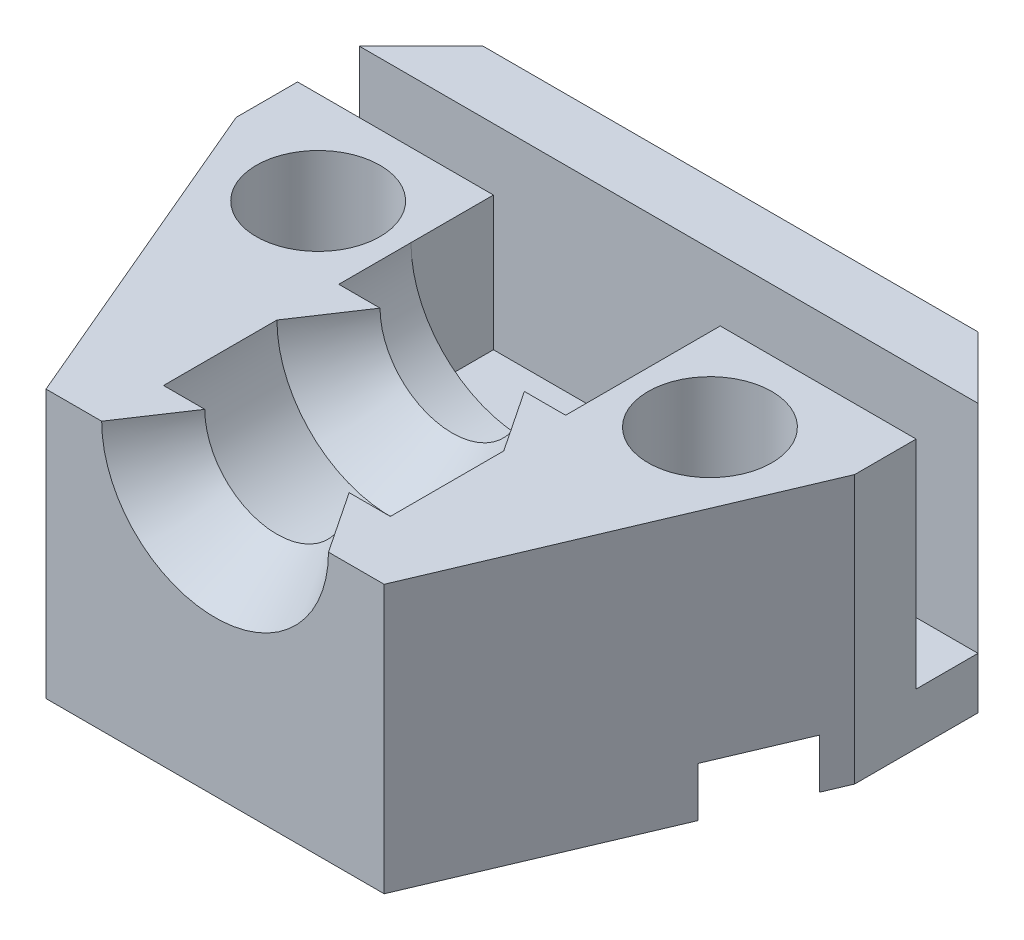
ISO-10303-21;
HEADER;
FILE_DESCRIPTION(('STEP AP214'),'2;1');
FILE_NAME('part.step','',(''),(''),'','','');
FILE_SCHEMA(('AUTOMOTIVE_DESIGN { 1 0 10303 214 1 1 1 1 }'));
ENDSEC;
DATA;
#1=APPLICATION_CONTEXT('core data for automotive mechanical design processes');
#2=APPLICATION_PROTOCOL_DEFINITION('international standard','automotive_design',2000,#1);
#3=PRODUCT_CONTEXT('',#1,'mechanical');
#4=PRODUCT('Part','Part','',(#3));
#5=PRODUCT_RELATED_PRODUCT_CATEGORY('part','',(#4));
#6=PRODUCT_DEFINITION_FORMATION('','',#4);
#7=PRODUCT_DEFINITION_CONTEXT('part definition',#1,'design');
#8=PRODUCT_DEFINITION('design','',#6,#7);
#9=PRODUCT_DEFINITION_SHAPE('','',#8);
#10=(LENGTH_UNIT() NAMED_UNIT(*) SI_UNIT(.MILLI.,.METRE.));
#11=(NAMED_UNIT(*) PLANE_ANGLE_UNIT() SI_UNIT($,.RADIAN.));
#12=(NAMED_UNIT(*) SI_UNIT($,.STERADIAN.) SOLID_ANGLE_UNIT());
#13=UNCERTAINTY_MEASURE_WITH_UNIT(LENGTH_MEASURE(1.E-05),#10,'distance_accuracy_value','');
#14=(GEOMETRIC_REPRESENTATION_CONTEXT(3) GLOBAL_UNCERTAINTY_ASSIGNED_CONTEXT((#13)) GLOBAL_UNIT_ASSIGNED_CONTEXT((#10,
#11,#12)) REPRESENTATION_CONTEXT('',''));
#15=CARTESIAN_POINT('',(0.,0.,0.));
#16=DIRECTION('',(0.,0.,1.));
#17=DIRECTION('',(1.,0.,0.));
#18=AXIS2_PLACEMENT_3D('',#15,#16,#17);
#19=CARTESIAN_POINT('',(0.,6.5,0.));
#20=DIRECTION('',(0.,1.,0.));
#21=DIRECTION('',(0.,0.,1.));
#22=AXIS2_PLACEMENT_3D('',#19,#20,#21);
#23=PLANE('',#22);
#24=CARTESIAN_POINT('',(4.75,6.5,-1.));
#25=DIRECTION('',(0.,1.,0.));
#26=DIRECTION('',(0.,0.,1.));
#27=AXIS2_PLACEMENT_3D('',#24,#25,#26);
#28=CIRCLE('',#27,1.5);
#29=CARTESIAN_POINT('',(4.75,6.5,-2.5));
#30=VERTEX_POINT('',#29);
#31=EDGE_CURVE('E297',#30,#30,#28,.T.);
#32=ORIENTED_EDGE('',*,*,#31,.F.);
#33=EDGE_LOOP('',(#32));
#34=FACE_BOUND('',#33,.T.);
#35=DIRECTION('',(-1.,0.,0.));
#36=VECTOR('',#35,1.);
#37=CARTESIAN_POINT('',(0.,6.5,-3.25));
#38=LINE('',#37,#36);
#39=CARTESIAN_POINT('',(7.5,6.5,-3.25));
#40=VERTEX_POINT('',#39);
#41=CARTESIAN_POINT('',(2.75,6.5,-3.25));
#42=VERTEX_POINT('',#41);
#43=EDGE_CURVE('E267',#40,#42,#38,.T.);
#44=ORIENTED_EDGE('',*,*,#43,.T.);
#45=DIRECTION('',(0.,0.,1.));
#46=VECTOR('',#45,1.);
#47=CARTESIAN_POINT('',(2.75,6.5,0.));
#48=LINE('',#47,#46);
#49=CARTESIAN_POINT('',(2.75,6.5,-1.25));
#50=VERTEX_POINT('',#49);
#51=EDGE_CURVE('E220',#42,#50,#48,.T.);
#52=ORIENTED_EDGE('',*,*,#51,.T.);
#53=DIRECTION('',(0.,0.,1.));
#54=VECTOR('',#53,1.);
#55=CARTESIAN_POINT('',(2.75000000000001,6.5,6.25));
#56=LINE('',#55,#54);
#57=CARTESIAN_POINT('',(2.75,6.5,0.5));
#58=VERTEX_POINT('',#57);
#59=EDGE_CURVE('E377',#58,#50,#56,.F.);
#60=ORIENTED_EDGE('',*,*,#59,.F.);
#61=DIRECTION('',(1.,0.,0.));
#62=VECTOR('',#61,1.);
#63=CARTESIAN_POINT('',(0.,6.5,0.500000000000001));
#64=LINE('',#63,#62);
#65=CARTESIAN_POINT('',(1.75,6.5,0.500000000000001));
#66=VERTEX_POINT('',#65);
#67=EDGE_CURVE('E375',#66,#58,#64,.T.);
#68=ORIENTED_EDGE('',*,*,#67,.F.);
#69=DIRECTION('',(-0.554700196225229,0.,-0.832050294337843));
#70=VECTOR('',#69,1.);
#71=CARTESIAN_POINT('',(0.,6.5,-2.125));
#72=LINE('',#71,#70);
#73=CARTESIAN_POINT('',(2.75,6.5,2.));
#74=VERTEX_POINT('',#73);
#75=EDGE_CURVE('E373',#74,#66,#72,.T.);
#76=ORIENTED_EDGE('',*,*,#75,.F.);
#77=DIRECTION('',(0.,0.,1.));
#78=VECTOR('',#77,1.);
#79=CARTESIAN_POINT('',(2.75,6.5,6.25));
#80=LINE('',#79,#78);
#81=CARTESIAN_POINT('',(2.75,6.5,4.75));
#82=VERTEX_POINT('',#81);
#83=EDGE_CURVE('E370',#82,#74,#80,.F.);
#84=ORIENTED_EDGE('',*,*,#83,.F.);
#85=DIRECTION('',(1.,0.,0.));
#86=VECTOR('',#85,1.);
#87=CARTESIAN_POINT('',(0.,6.5,4.75));
#88=LINE('',#87,#86);
#89=CARTESIAN_POINT('',(1.75,6.5,4.75));
#90=VERTEX_POINT('',#89);
#91=EDGE_CURVE('E368',#90,#82,#88,.T.);
#92=ORIENTED_EDGE('',*,*,#91,.F.);
#93=DIRECTION('',(-0.554700196225229,0.,-0.832050294337844));
#94=VECTOR('',#93,1.);
#95=CARTESIAN_POINT('',(0.,6.5,2.12499999999999));
#96=LINE('',#95,#94);
#97=CARTESIAN_POINT('',(2.75,6.5,6.25));
#98=VERTEX_POINT('',#97);
#99=EDGE_CURVE('E250',#98,#90,#96,.T.);
#100=ORIENTED_EDGE('',*,*,#99,.F.);
#101=DIRECTION('',(1.,0.,0.));
#102=VECTOR('',#101,1.);
#103=CARTESIAN_POINT('',(-7.5,6.5,6.25));
#104=LINE('',#103,#102);
#105=CARTESIAN_POINT('',(4.09999999999999,6.5,6.25));
#106=VERTEX_POINT('',#105);
#107=EDGE_CURVE('E311',#98,#106,#104,.T.);
#108=ORIENTED_EDGE('',*,*,#107,.T.);
#109=DIRECTION('',(-0.390731128489275,0.,0.92050485345244));
#110=VECTOR('',#109,1.);
#111=CARTESIAN_POINT('',(5.72198653549922,6.5,2.42883918300988));
#112=LINE('',#111,#110);
#113=CARTESIAN_POINT('',(7.5,6.5,-1.75989804380075));
#114=VERTEX_POINT('',#113);
#115=EDGE_CURVE('E340',#106,#114,#112,.F.);
#116=ORIENTED_EDGE('',*,*,#115,.T.);
#117=DIRECTION('',(0.,0.,-1.));
#118=VECTOR('',#117,1.);
#119=CARTESIAN_POINT('',(7.5,6.5,-6.25));
#120=LINE('',#119,#118);
#121=EDGE_CURVE('E303',#114,#40,#120,.T.);
#122=ORIENTED_EDGE('',*,*,#121,.T.);
#123=EDGE_LOOP('',(#44,#52,#60,#68,#76,#84,#92,#100,#108,#116,#122));
#124=FACE_BOUND('',#123,.T.);
#125=ADVANCED_FACE('F33',(#34,#124),#23,.T.);
#126=CARTESIAN_POINT('',(-4.75,6.5,-1.));
#127=DIRECTION('',(0.,1.,0.));
#128=DIRECTION('',(0.,0.,1.));
#129=AXIS2_PLACEMENT_3D('',#126,#127,#128);
#130=CIRCLE('',#129,1.5);
#131=CARTESIAN_POINT('',(-4.75,6.5,-2.5));
#132=VERTEX_POINT('',#131);
#133=EDGE_CURVE('E288',#132,#132,#130,.T.);
#134=ORIENTED_EDGE('',*,*,#133,.F.);
#135=EDGE_LOOP('',(#134));
#136=FACE_BOUND('',#135,.T.);
#137=DIRECTION('',(0.,0.,1.));
#138=VECTOR('',#137,1.);
#139=CARTESIAN_POINT('',(-2.75,6.5,6.25));
#140=LINE('',#139,#138);
#141=CARTESIAN_POINT('',(-2.75,6.5,-1.25));
#142=VERTEX_POINT('',#141);
#143=CARTESIAN_POINT('',(-2.75,6.5,0.500000000000003));
#144=VERTEX_POINT('',#143);
#145=EDGE_CURVE('E381',#142,#144,#140,.T.);
#146=ORIENTED_EDGE('',*,*,#145,.F.);
#147=DIRECTION('',(0.,0.,-1.));
#148=VECTOR('',#147,1.);
#149=CARTESIAN_POINT('',(-2.75,6.5,0.));
#150=LINE('',#149,#148);
#151=CARTESIAN_POINT('',(-2.75,6.5,-3.25));
#152=VERTEX_POINT('',#151);
#153=EDGE_CURVE('E429',#142,#152,#150,.T.);
#154=ORIENTED_EDGE('',*,*,#153,.T.);
#155=CARTESIAN_POINT('',(-7.5,6.5,-3.25));
#156=VERTEX_POINT('',#155);
#157=EDGE_CURVE('E225',#152,#156,#38,.T.);
#158=ORIENTED_EDGE('',*,*,#157,.T.);
#159=DIRECTION('',(0.,0.,1.));
#160=VECTOR('',#159,1.);
#161=CARTESIAN_POINT('',(-7.5,6.5,-6.25));
#162=LINE('',#161,#160);
#163=CARTESIAN_POINT('',(-7.5,6.5,-1.75989804380075));
#164=VERTEX_POINT('',#163);
#165=EDGE_CURVE('E309',#156,#164,#162,.T.);
#166=ORIENTED_EDGE('',*,*,#165,.T.);
#167=DIRECTION('',(-0.390731128489275,0.,-0.92050485345244));
#168=VECTOR('',#167,1.);
#169=CARTESIAN_POINT('',(-5.72198653549922,6.5,2.42883918300987));
#170=LINE('',#169,#168);
#171=CARTESIAN_POINT('',(-4.09999999999999,6.5,6.25));
#172=VERTEX_POINT('',#171);
#173=EDGE_CURVE('E342',#164,#172,#170,.F.);
#174=ORIENTED_EDGE('',*,*,#173,.T.);
#175=CARTESIAN_POINT('',(-2.75,6.5,6.25));
#176=VERTEX_POINT('',#175);
#177=EDGE_CURVE('E312',#172,#176,#104,.T.);
#178=ORIENTED_EDGE('',*,*,#177,.T.);
#179=DIRECTION('',(-0.554700196225228,0.,0.832050294337844));
#180=VECTOR('',#179,1.);
#181=CARTESIAN_POINT('',(0.,6.5,2.12499999999999));
#182=LINE('',#181,#180);
#183=CARTESIAN_POINT('',(-1.75,6.5,4.75));
#184=VERTEX_POINT('',#183);
#185=EDGE_CURVE('E252',#184,#176,#182,.T.);
#186=ORIENTED_EDGE('',*,*,#185,.F.);
#187=CARTESIAN_POINT('',(-2.75,6.5,4.75));
#188=VERTEX_POINT('',#187);
#189=EDGE_CURVE('E371',#188,#184,#88,.T.);
#190=ORIENTED_EDGE('',*,*,#189,.F.);
#191=DIRECTION('',(0.,0.,1.));
#192=VECTOR('',#191,1.);
#193=CARTESIAN_POINT('',(-2.75,6.5,6.25));
#194=LINE('',#193,#192);
#195=CARTESIAN_POINT('',(-2.75,6.5,2.));
#196=VERTEX_POINT('',#195);
#197=EDGE_CURVE('E385',#196,#188,#194,.T.);
#198=ORIENTED_EDGE('',*,*,#197,.F.);
#199=DIRECTION('',(-0.554700196225229,0.,0.832050294337844));
#200=VECTOR('',#199,1.);
#201=CARTESIAN_POINT('',(0.,6.5,-2.125));
#202=LINE('',#201,#200);
#203=CARTESIAN_POINT('',(-1.75,6.5,0.500000000000002));
#204=VERTEX_POINT('',#203);
#205=EDGE_CURVE('E383',#204,#196,#202,.T.);
#206=ORIENTED_EDGE('',*,*,#205,.F.);
#207=EDGE_CURVE('E378',#144,#204,#64,.T.);
#208=ORIENTED_EDGE('',*,*,#207,.F.);
#209=EDGE_LOOP('',(#146,#154,#158,#166,#174,#178,#186,#190,#198,#206,#208));
#210=FACE_BOUND('',#209,.T.);
#211=ADVANCED_FACE('F427',(#136,#210),#23,.T.);
#212=CARTESIAN_POINT('',(0.,1.25,-3.25));
#213=DIRECTION('',(0.,0.,-1.));
#214=DIRECTION('',(-1.,0.,0.));
#215=AXIS2_PLACEMENT_3D('',#212,#213,#214);
#216=PLANE('',#215);
#217=DIRECTION('',(1.,0.,0.));
#218=VECTOR('',#217,1.);
#219=CARTESIAN_POINT('',(0.,3.25,-3.25));
#220=LINE('',#219,#218);
#221=CARTESIAN_POINT('',(-2.75,3.25,-3.25));
#222=VERTEX_POINT('',#221);
#223=CARTESIAN_POINT('',(2.75,3.25,-3.25));
#224=VERTEX_POINT('',#223);
#225=EDGE_CURVE('E212',#222,#224,#220,.T.);
#226=ORIENTED_EDGE('',*,*,#225,.T.);
#227=DIRECTION('',(0.,1.,0.));
#228=VECTOR('',#227,1.);
#229=CARTESIAN_POINT('',(2.75,3.25,-3.25));
#230=LINE('',#229,#228);
#231=EDGE_CURVE('E236',#224,#42,#230,.T.);
#232=ORIENTED_EDGE('',*,*,#231,.T.);
#233=ORIENTED_EDGE('',*,*,#43,.F.);
#234=DIRECTION('',(0.,1.,0.));
#235=VECTOR('',#234,1.);
#236=CARTESIAN_POINT('',(7.5,1.25,-3.25));
#237=LINE('',#236,#235);
#238=CARTESIAN_POINT('',(7.5,1.25,-3.25));
#239=VERTEX_POINT('',#238);
#240=EDGE_CURVE('E266',#239,#40,#237,.T.);
#241=ORIENTED_EDGE('',*,*,#240,.F.);
#242=DIRECTION('',(-1.,0.,0.));
#243=VECTOR('',#242,1.);
#244=CARTESIAN_POINT('',(0.,1.25,-3.25));
#245=LINE('',#244,#243);
#246=CARTESIAN_POINT('',(-7.5,1.25,-3.25));
#247=VERTEX_POINT('',#246);
#248=EDGE_CURVE('E254',#239,#247,#245,.T.);
#249=ORIENTED_EDGE('',*,*,#248,.T.);
#250=DIRECTION('',(0.,1.,0.));
#251=VECTOR('',#250,1.);
#252=CARTESIAN_POINT('',(-7.5,1.25,-3.25));
#253=LINE('',#252,#251);
#254=EDGE_CURVE('E271',#247,#156,#253,.T.);
#255=ORIENTED_EDGE('',*,*,#254,.T.);
#256=ORIENTED_EDGE('',*,*,#157,.F.);
#257=DIRECTION('',(0.,1.,0.));
#258=VECTOR('',#257,1.);
#259=CARTESIAN_POINT('',(-2.75,3.25,-3.25));
#260=LINE('',#259,#258);
#261=EDGE_CURVE('E205',#222,#152,#260,.T.);
#262=ORIENTED_EDGE('',*,*,#261,.F.);
#263=EDGE_LOOP('',(#226,#232,#233,#241,#249,#255,#256,#262));
#264=FACE_BOUND('',#263,.T.);
#265=ADVANCED_FACE('F223',(#264),#216,.T.);
#266=CARTESIAN_POINT('',(7.5,6.5,-6.25));
#267=DIRECTION('',(-1.,0.,0.));
#268=DIRECTION('',(0.,0.,1.));
#269=AXIS2_PLACEMENT_3D('',#266,#267,#268);
#270=PLANE('',#269);
#271=DIRECTION('',(0.,0.,-1.));
#272=VECTOR('',#271,1.);
#273=CARTESIAN_POINT('',(7.5,0.,-6.25));
#274=LINE('',#273,#272);
#275=CARTESIAN_POINT('',(7.5,0.,-1.75989804380075));
#276=VERTEX_POINT('',#275);
#277=CARTESIAN_POINT('',(7.5,0.,-4.75));
#278=VERTEX_POINT('',#277);
#279=EDGE_CURVE('E300',#276,#278,#274,.T.);
#280=ORIENTED_EDGE('',*,*,#279,.T.);
#281=DIRECTION('',(0.,1.,0.));
#282=VECTOR('',#281,1.);
#283=CARTESIAN_POINT('',(7.5,6.5,-4.75));
#284=LINE('',#283,#282);
#285=CARTESIAN_POINT('',(7.5,1.25,-4.75));
#286=VERTEX_POINT('',#285);
#287=EDGE_CURVE('E11',#278,#286,#284,.T.);
#288=ORIENTED_EDGE('',*,*,#287,.T.);
#289=DIRECTION('',(0.,0.,-1.));
#290=VECTOR('',#289,1.);
#291=CARTESIAN_POINT('',(7.5,1.25,0.));
#292=LINE('',#291,#290);
#293=EDGE_CURVE('E256',#239,#286,#292,.T.);
#294=ORIENTED_EDGE('',*,*,#293,.F.);
#295=ORIENTED_EDGE('',*,*,#240,.T.);
#296=ORIENTED_EDGE('',*,*,#121,.F.);
#297=DIRECTION('',(0.,-1.,0.));
#298=VECTOR('',#297,1.);
#299=CARTESIAN_POINT('',(7.5,6.5,-1.75989804380075));
#300=LINE('',#299,#298);
#301=EDGE_CURVE('E344',#114,#276,#300,.T.);
#302=ORIENTED_EDGE('',*,*,#301,.T.);
#303=EDGE_LOOP('',(#280,#288,#294,#295,#296,#302));
#304=FACE_BOUND('',#303,.T.);
#305=ADVANCED_FACE('F440',(#304),#270,.F.);
#306=CARTESIAN_POINT('',(-7.5,6.5,-6.25));
#307=DIRECTION('',(1.,0.,0.));
#308=DIRECTION('',(0.,0.,-1.));
#309=AXIS2_PLACEMENT_3D('',#306,#307,#308);
#310=PLANE('',#309);
#311=DIRECTION('',(0.,0.,1.));
#312=VECTOR('',#311,1.);
#313=CARTESIAN_POINT('',(-7.5,1.25,0.));
#314=LINE('',#313,#312);
#315=CARTESIAN_POINT('',(-7.5,1.25,-4.75));
#316=VERTEX_POINT('',#315);
#317=EDGE_CURVE('E263',#316,#247,#314,.T.);
#318=ORIENTED_EDGE('',*,*,#317,.F.);
#319=DIRECTION('',(0.,-1.,0.));
#320=VECTOR('',#319,1.);
#321=CARTESIAN_POINT('',(-7.5,6.5,-4.75));
#322=LINE('',#321,#320);
#323=CARTESIAN_POINT('',(-7.5,0.,-4.75));
#324=VERTEX_POINT('',#323);
#325=EDGE_CURVE('E387',#316,#324,#322,.T.);
#326=ORIENTED_EDGE('',*,*,#325,.T.);
#327=DIRECTION('',(0.,0.,1.));
#328=VECTOR('',#327,1.);
#329=CARTESIAN_POINT('',(-7.5,0.,-6.25));
#330=LINE('',#329,#328);
#331=CARTESIAN_POINT('',(-7.5,0.,-1.75989804380075));
#332=VERTEX_POINT('',#331);
#333=EDGE_CURVE('E320',#324,#332,#330,.T.);
#334=ORIENTED_EDGE('',*,*,#333,.T.);
#335=DIRECTION('',(0.,1.,0.));
#336=VECTOR('',#335,1.);
#337=CARTESIAN_POINT('',(-7.5,6.5,-1.75989804380075));
#338=LINE('',#337,#336);
#339=EDGE_CURVE('E337',#332,#164,#338,.T.);
#340=ORIENTED_EDGE('',*,*,#339,.T.);
#341=ORIENTED_EDGE('',*,*,#165,.F.);
#342=ORIENTED_EDGE('',*,*,#254,.F.);
#343=EDGE_LOOP('',(#318,#326,#334,#340,#341,#342));
#344=FACE_BOUND('',#343,.T.);
#345=ADVANCED_FACE('F411',(#344),#310,.F.);
#346=DIRECTION('',(-1.,0.,0.));
#347=VECTOR('',#346,1.);
#348=CARTESIAN_POINT('',(-7.5,6.5,-6.25));
#349=LINE('',#348,#347);
#350=CARTESIAN_POINT('',(6.,6.5,-6.25));
#351=VERTEX_POINT('',#350);
#352=CARTESIAN_POINT('',(-6.,6.5,-6.25));
#353=VERTEX_POINT('',#352);
#354=EDGE_CURVE('E306',#351,#353,#349,.T.);
#355=ORIENTED_EDGE('',*,*,#354,.T.);
#356=DIRECTION('',(0.707106781186549,0.,-0.707106781186547));
#357=VECTOR('',#356,1.);
#358=CARTESIAN_POINT('',(-6.12499999999999,6.5,-6.12500000000001));
#359=LINE('',#358,#357);
#360=CARTESIAN_POINT('',(-7.5,6.5,-4.75));
#361=VERTEX_POINT('',#360);
#362=EDGE_CURVE('E41',#353,#361,#359,.F.);
#363=ORIENTED_EDGE('',*,*,#362,.T.);
#364=DIRECTION('',(1.,0.,0.));
#365=VECTOR('',#364,1.);
#366=CARTESIAN_POINT('',(0.,6.5,-4.75));
#367=LINE('',#366,#365);
#368=CARTESIAN_POINT('',(7.5,6.5,-4.75));
#369=VERTEX_POINT('',#368);
#370=EDGE_CURVE('E257',#361,#369,#367,.T.);
#371=ORIENTED_EDGE('',*,*,#370,.T.);
#372=DIRECTION('',(0.707106781186546,0.,0.707106781186548));
#373=VECTOR('',#372,1.);
#374=CARTESIAN_POINT('',(6.12500000000001,6.5,-6.12499999999999));
#375=LINE('',#374,#373);
#376=EDGE_CURVE('E55',#369,#351,#375,.F.);
#377=ORIENTED_EDGE('',*,*,#376,.T.);
#378=EDGE_LOOP('',(#355,#363,#371,#377));
#379=FACE_BOUND('',#378,.T.);
#380=ADVANCED_FACE('F399',(#379),#23,.T.);
#381=CARTESIAN_POINT('',(0.,0.,0.));
#382=DIRECTION('',(0.,1.,0.));
#383=DIRECTION('',(0.,0.,1.));
#384=AXIS2_PLACEMENT_3D('',#381,#382,#383);
#385=PLANE('',#384);
#386=ORIENTED_EDGE('',*,*,#333,.F.);
#387=DIRECTION('',(-0.707106781186549,0.,0.707106781186547));
#388=VECTOR('',#387,1.);
#389=CARTESIAN_POINT('',(-7.5,0.,-4.75));
#390=LINE('',#389,#388);
#391=CARTESIAN_POINT('',(-6.,0.,-6.25));
#392=VERTEX_POINT('',#391);
#393=EDGE_CURVE('E391',#324,#392,#390,.F.);
#394=ORIENTED_EDGE('',*,*,#393,.T.);
#395=DIRECTION('',(-1.,0.,0.));
#396=VECTOR('',#395,1.);
#397=CARTESIAN_POINT('',(-7.5,0.,-6.25));
#398=LINE('',#397,#396);
#399=CARTESIAN_POINT('',(6.,0.,-6.25));
#400=VERTEX_POINT('',#399);
#401=EDGE_CURVE('E318',#400,#392,#398,.T.);
#402=ORIENTED_EDGE('',*,*,#401,.F.);
#403=DIRECTION('',(-0.707106781186546,0.,-0.707106781186548));
#404=VECTOR('',#403,1.);
#405=CARTESIAN_POINT('',(6.,0.,-6.25));
#406=LINE('',#405,#404);
#407=EDGE_CURVE('E389',#400,#278,#406,.F.);
#408=ORIENTED_EDGE('',*,*,#407,.T.);
#409=ORIENTED_EDGE('',*,*,#279,.F.);
#410=DIRECTION('',(0.390731128489275,0.,-0.92050485345244));
#411=VECTOR('',#410,1.);
#412=CARTESIAN_POINT('',(7.5,0.,-1.75989804380075));
#413=LINE('',#412,#411);
#414=CARTESIAN_POINT('',(7.24493805479352,0.,-1.15900975675446));
#415=VERTEX_POINT('',#414);
#416=EDGE_CURVE('E330',#276,#415,#413,.F.);
#417=ORIENTED_EDGE('',*,*,#416,.T.);
#418=CARTESIAN_POINT('',(4.75,0.,-1.));
#419=DIRECTION('',(0.,1.,0.));
#420=DIRECTION('',(0.,0.,1.));
#421=AXIS2_PLACEMENT_3D('',#418,#419,#420);
#422=CIRCLE('',#421,2.5);
#423=CARTESIAN_POINT('',(6.36874755686335,0.,0.905165700706612));
#424=VERTEX_POINT('',#423);
#425=EDGE_CURVE('E284',#415,#424,#422,.T.);
#426=ORIENTED_EDGE('',*,*,#425,.T.);
#427=CARTESIAN_POINT('',(4.09999999999999,0.,6.25));
#428=VERTEX_POINT('',#427);
#429=EDGE_CURVE('E329',#424,#428,#413,.F.);
#430=ORIENTED_EDGE('',*,*,#429,.T.);
#431=DIRECTION('',(1.,0.,0.));
#432=VECTOR('',#431,1.);
#433=CARTESIAN_POINT('',(-7.5,0.,6.25));
#434=LINE('',#433,#432);
#435=CARTESIAN_POINT('',(-4.09999999999999,0.,6.25));
#436=VERTEX_POINT('',#435);
#437=EDGE_CURVE('E307',#436,#428,#434,.T.);
#438=ORIENTED_EDGE('',*,*,#437,.F.);
#439=DIRECTION('',(0.390731128489275,0.,0.92050485345244));
#440=VECTOR('',#439,1.);
#441=CARTESIAN_POINT('',(-4.09999999999999,0.,6.25));
#442=LINE('',#441,#440);
#443=CARTESIAN_POINT('',(-6.36874755686335,0.,0.905165700706615));
#444=VERTEX_POINT('',#443);
#445=EDGE_CURVE('E334',#436,#444,#442,.F.);
#446=ORIENTED_EDGE('',*,*,#445,.T.);
#447=CARTESIAN_POINT('',(-4.75,0.,-1.));
#448=DIRECTION('',(0.,1.,0.));
#449=DIRECTION('',(0.,0.,1.));
#450=AXIS2_PLACEMENT_3D('',#447,#448,#449);
#451=CIRCLE('',#450,2.5);
#452=CARTESIAN_POINT('',(-7.24493805479352,0.,-1.15900975675447));
#453=VERTEX_POINT('',#452);
#454=EDGE_CURVE('E293',#444,#453,#451,.T.);
#455=ORIENTED_EDGE('',*,*,#454,.T.);
#456=EDGE_CURVE('E333',#453,#332,#442,.F.);
#457=ORIENTED_EDGE('',*,*,#456,.T.);
#458=EDGE_LOOP('',(#386,#394,#402,#408,#409,#417,#426,#430,#438,#446,#455,#457));
#459=FACE_BOUND('',#458,.T.);
#460=ADVANCED_FACE('F415',(#459),#385,.F.);
#461=CARTESIAN_POINT('',(-4.09999999999999,6.5,6.25));
#462=DIRECTION('',(0.92050485345244,0.,-0.390731128489275));
#463=DIRECTION('',(0.,-1.,0.));
#464=AXIS2_PLACEMENT_3D('',#461,#462,#463);
#465=PLANE('',#464);
#466=DIRECTION('',(0.390731128489275,0.,0.92050485345244));
#467=VECTOR('',#466,1.);
#468=CARTESIAN_POINT('',(-4.09999999999999,1.2,6.25));
#469=LINE('',#468,#467);
#470=CARTESIAN_POINT('',(-6.36874755686335,1.2,0.905165700706615));
#471=VERTEX_POINT('',#470);
#472=CARTESIAN_POINT('',(-7.24493805479352,1.2,-1.15900975675447));
#473=VERTEX_POINT('',#472);
#474=EDGE_CURVE('E359',#471,#473,#469,.F.);
#475=ORIENTED_EDGE('',*,*,#474,.F.);
#476=DIRECTION('',(0.,-1.,0.));
#477=VECTOR('',#476,1.);
#478=CARTESIAN_POINT('',(-6.36874755686335,1.2,0.905165700706615));
#479=LINE('',#478,#477);
#480=EDGE_CURVE('E362',#471,#444,#479,.T.);
#481=ORIENTED_EDGE('',*,*,#480,.T.);
#482=ORIENTED_EDGE('',*,*,#445,.F.);
#483=DIRECTION('',(0.,-1.,0.));
#484=VECTOR('',#483,1.);
#485=CARTESIAN_POINT('',(-4.09999999999999,6.5,6.25));
#486=LINE('',#485,#484);
#487=EDGE_CURVE('E326',#172,#436,#486,.T.);
#488=ORIENTED_EDGE('',*,*,#487,.F.);
#489=ORIENTED_EDGE('',*,*,#173,.F.);
#490=ORIENTED_EDGE('',*,*,#339,.F.);
#491=ORIENTED_EDGE('',*,*,#456,.F.);
#492=DIRECTION('',(0.,-1.,0.));
#493=VECTOR('',#492,1.);
#494=CARTESIAN_POINT('',(-7.24493805479352,1.2,-1.15900975675447));
#495=LINE('',#494,#493);
#496=EDGE_CURVE('E356',#453,#473,#495,.F.);
#497=ORIENTED_EDGE('',*,*,#496,.T.);
#498=EDGE_LOOP('',(#475,#481,#482,#488,#489,#490,#491,#497));
#499=FACE_BOUND('',#498,.T.);
#500=ADVANCED_FACE('F422',(#499),#465,.F.);
#501=CARTESIAN_POINT('',(7.5,6.5,-1.75989804380075));
#502=DIRECTION('',(-0.92050485345244,0.,-0.390731128489275));
#503=DIRECTION('',(0.,-1.,0.));
#504=AXIS2_PLACEMENT_3D('',#501,#502,#503);
#505=PLANE('',#504);
#506=DIRECTION('',(0.390731128489275,0.,-0.92050485345244));
#507=VECTOR('',#506,1.);
#508=CARTESIAN_POINT('',(7.5,1.2,-1.75989804380075));
#509=LINE('',#508,#507);
#510=CARTESIAN_POINT('',(7.24493805479352,1.2,-1.15900975675446));
#511=VERTEX_POINT('',#510);
#512=CARTESIAN_POINT('',(6.36874755686335,1.2,0.905165700706612));
#513=VERTEX_POINT('',#512);
#514=EDGE_CURVE('E350',#511,#513,#509,.F.);
#515=ORIENTED_EDGE('',*,*,#514,.F.);
#516=DIRECTION('',(0.,-1.,0.));
#517=VECTOR('',#516,1.);
#518=CARTESIAN_POINT('',(7.24493805479352,1.2,-1.15900975675446));
#519=LINE('',#518,#517);
#520=EDGE_CURVE('E353',#511,#415,#519,.T.);
#521=ORIENTED_EDGE('',*,*,#520,.T.);
#522=ORIENTED_EDGE('',*,*,#416,.F.);
#523=ORIENTED_EDGE('',*,*,#301,.F.);
#524=ORIENTED_EDGE('',*,*,#115,.F.);
#525=DIRECTION('',(0.,1.,0.));
#526=VECTOR('',#525,1.);
#527=CARTESIAN_POINT('',(4.09999999999999,6.5,6.25));
#528=LINE('',#527,#526);
#529=EDGE_CURVE('E315',#428,#106,#528,.T.);
#530=ORIENTED_EDGE('',*,*,#529,.F.);
#531=ORIENTED_EDGE('',*,*,#429,.F.);
#532=DIRECTION('',(0.,-1.,0.));
#533=VECTOR('',#532,1.);
#534=CARTESIAN_POINT('',(6.36874755686335,1.2,0.905165700706612));
#535=LINE('',#534,#533);
#536=EDGE_CURVE('E347',#424,#513,#535,.F.);
#537=ORIENTED_EDGE('',*,*,#536,.T.);
#538=EDGE_LOOP('',(#515,#521,#522,#523,#524,#530,#531,#537));
#539=FACE_BOUND('',#538,.T.);
#540=ADVANCED_FACE('F446',(#539),#505,.F.);
#541=CARTESIAN_POINT('',(-7.5,6.5,-6.25));
#542=DIRECTION('',(0.,0.,1.));
#543=DIRECTION('',(1.,0.,0.));
#544=AXIS2_PLACEMENT_3D('',#541,#542,#543);
#545=PLANE('',#544);
#546=ORIENTED_EDGE('',*,*,#401,.T.);
#547=DIRECTION('',(0.,1.,0.));
#548=VECTOR('',#547,1.);
#549=CARTESIAN_POINT('',(-6.,6.5,-6.25));
#550=LINE('',#549,#548);
#551=EDGE_CURVE('E48',#392,#353,#550,.T.);
#552=ORIENTED_EDGE('',*,*,#551,.T.);
#553=ORIENTED_EDGE('',*,*,#354,.F.);
#554=DIRECTION('',(0.,-1.,0.));
#555=VECTOR('',#554,1.);
#556=CARTESIAN_POINT('',(6.,6.5,-6.25));
#557=LINE('',#556,#555);
#558=EDGE_CURVE('E393',#351,#400,#557,.T.);
#559=ORIENTED_EDGE('',*,*,#558,.T.);
#560=EDGE_LOOP('',(#546,#552,#553,#559));
#561=FACE_BOUND('',#560,.T.);
#562=ADVANCED_FACE('F438',(#561),#545,.F.);
#563=CARTESIAN_POINT('',(-7.5,6.5,6.25));
#564=DIRECTION('',(0.,0.,-1.));
#565=DIRECTION('',(-1.,0.,0.));
#566=AXIS2_PLACEMENT_3D('',#563,#564,#565);
#567=PLANE('',#566);
#568=ORIENTED_EDGE('',*,*,#107,.F.);
#569=CARTESIAN_POINT('',(0.,6.5,6.25));
#570=DIRECTION('',(0.,0.,-1.));
#571=DIRECTION('',(-1.,0.,0.));
#572=AXIS2_PLACEMENT_3D('',#569,#570,#571);
#573=CIRCLE('',#572,2.75);
#574=EDGE_CURVE('E365',#98,#176,#573,.T.);
#575=ORIENTED_EDGE('',*,*,#574,.T.);
#576=ORIENTED_EDGE('',*,*,#177,.F.);
#577=ORIENTED_EDGE('',*,*,#487,.T.);
#578=ORIENTED_EDGE('',*,*,#437,.T.);
#579=ORIENTED_EDGE('',*,*,#529,.T.);
#580=EDGE_LOOP('',(#568,#575,#576,#577,#578,#579));
#581=FACE_BOUND('',#580,.T.);
#582=ADVANCED_FACE('F453',(#581),#567,.F.);
#583=CARTESIAN_POINT('',(-4.75,6.5,-1.));
#584=DIRECTION('',(0.,-1.,0.));
#585=DIRECTION('',(0.,0.,-1.));
#586=AXIS2_PLACEMENT_3D('',#583,#584,#585);
#587=CYLINDRICAL_SURFACE('',#586,1.5);
#588=CARTESIAN_POINT('',(-4.75,1.2,-1.));
#589=DIRECTION('',(0.,1.,0.));
#590=DIRECTION('',(0.,0.,1.));
#591=AXIS2_PLACEMENT_3D('',#588,#589,#590);
#592=CIRCLE('',#591,1.5);
#593=CARTESIAN_POINT('',(-4.75,1.2,-2.5));
#594=VERTEX_POINT('',#593);
#595=EDGE_CURVE('E273',#594,#594,#592,.T.);
#596=CARTESIAN_POINT('',(-4.75,1.2,-2.5));
#597=CARTESIAN_POINT('',(-4.75,1.25520833333333,-2.5));
#598=CARTESIAN_POINT('',(-4.75,1.31041666666667,-2.5));
#599=CARTESIAN_POINT('',(-4.75,1.42083333333333,-2.5));
#600=CARTESIAN_POINT('',(-4.75,1.47604166666667,-2.5));
#601=CARTESIAN_POINT('',(-4.75,1.58645833333333,-2.5));
#602=CARTESIAN_POINT('',(-4.75,1.64166666666667,-2.5));
#603=CARTESIAN_POINT('',(-4.75,1.75208333333333,-2.5));
#604=CARTESIAN_POINT('',(-4.75,1.80729166666667,-2.5));
#605=CARTESIAN_POINT('',(-4.75,1.91770833333333,-2.5));
#606=CARTESIAN_POINT('',(-4.75,1.97291666666667,-2.5));
#607=CARTESIAN_POINT('',(-4.75,2.08333333333333,-2.5));
#608=CARTESIAN_POINT('',(-4.75,2.13854166666667,-2.5));
#609=CARTESIAN_POINT('',(-4.75,2.24895833333333,-2.5));
#610=CARTESIAN_POINT('',(-4.75,2.30416666666667,-2.5));
#611=CARTESIAN_POINT('',(-4.75,2.41458333333333,-2.5));
#612=CARTESIAN_POINT('',(-4.75,2.46979166666667,-2.5));
#613=CARTESIAN_POINT('',(-4.75,2.58020833333333,-2.5));
#614=CARTESIAN_POINT('',(-4.75,2.63541666666667,-2.5));
#615=CARTESIAN_POINT('',(-4.75,2.74583333333333,-2.5));
#616=CARTESIAN_POINT('',(-4.75,2.80104166666667,-2.5));
#617=CARTESIAN_POINT('',(-4.75,2.91145833333333,-2.5));
#618=CARTESIAN_POINT('',(-4.75,2.96666666666667,-2.5));
#619=CARTESIAN_POINT('',(-4.75,3.07708333333333,-2.5));
#620=CARTESIAN_POINT('',(-4.75,3.13229166666667,-2.5));
#621=CARTESIAN_POINT('',(-4.75,3.24270833333333,-2.5));
#622=CARTESIAN_POINT('',(-4.75,3.29791666666667,-2.5));
#623=CARTESIAN_POINT('',(-4.75,3.40833333333333,-2.5));
#624=CARTESIAN_POINT('',(-4.75,3.46354166666667,-2.5));
#625=CARTESIAN_POINT('',(-4.75,3.57395833333333,-2.5));
#626=CARTESIAN_POINT('',(-4.75,3.62916666666667,-2.5));
#627=CARTESIAN_POINT('',(-4.75,3.73958333333333,-2.5));
#628=CARTESIAN_POINT('',(-4.75,3.79479166666667,-2.5));
#629=CARTESIAN_POINT('',(-4.75,3.90520833333333,-2.5));
#630=CARTESIAN_POINT('',(-4.75,3.96041666666667,-2.5));
#631=CARTESIAN_POINT('',(-4.75,4.07083333333333,-2.5));
#632=CARTESIAN_POINT('',(-4.75,4.12604166666667,-2.5));
#633=CARTESIAN_POINT('',(-4.75,4.23645833333333,-2.5));
#634=CARTESIAN_POINT('',(-4.75,4.29166666666667,-2.5));
#635=CARTESIAN_POINT('',(-4.75,4.40208333333333,-2.5));
#636=CARTESIAN_POINT('',(-4.75,4.45729166666667,-2.5));
#637=CARTESIAN_POINT('',(-4.75,4.56770833333333,-2.5));
#638=CARTESIAN_POINT('',(-4.75,4.62291666666667,-2.5));
#639=CARTESIAN_POINT('',(-4.75,4.73333333333333,-2.5));
#640=CARTESIAN_POINT('',(-4.75,4.78854166666667,-2.5));
#641=CARTESIAN_POINT('',(-4.75,4.89895833333333,-2.5));
#642=CARTESIAN_POINT('',(-4.75,4.95416666666667,-2.5));
#643=CARTESIAN_POINT('',(-4.75,5.06458333333333,-2.5));
#644=CARTESIAN_POINT('',(-4.75,5.11979166666667,-2.5));
#645=CARTESIAN_POINT('',(-4.75,5.23020833333333,-2.5));
#646=CARTESIAN_POINT('',(-4.75,5.28541666666667,-2.5));
#647=CARTESIAN_POINT('',(-4.75,5.39583333333333,-2.5));
#648=CARTESIAN_POINT('',(-4.75,5.45104166666667,-2.5));
#649=CARTESIAN_POINT('',(-4.75,5.56145833333333,-2.5));
#650=CARTESIAN_POINT('',(-4.75,5.61666666666667,-2.5));
#651=CARTESIAN_POINT('',(-4.75,5.72708333333333,-2.5));
#652=CARTESIAN_POINT('',(-4.75,5.78229166666667,-2.5));
#653=CARTESIAN_POINT('',(-4.75,5.89270833333333,-2.5));
#654=CARTESIAN_POINT('',(-4.75,5.94791666666667,-2.5));
#655=CARTESIAN_POINT('',(-4.75,6.05833333333333,-2.5));
#656=CARTESIAN_POINT('',(-4.75,6.11354166666667,-2.5));
#657=CARTESIAN_POINT('',(-4.75,6.22395833333333,-2.5));
#658=CARTESIAN_POINT('',(-4.75,6.27916666666667,-2.5));
#659=CARTESIAN_POINT('',(-4.75,6.38958333333333,-2.5));
#660=CARTESIAN_POINT('',(-4.75,6.44479166666667,-2.5));
#661=CARTESIAN_POINT('',(-4.75,6.5,-2.5));
#662=B_SPLINE_CURVE_WITH_KNOTS('',3,(#596,#597,#598,#599,#600,#601,#602,#603,#604,#605,#606,
#607,#608,#609,#610,#611,#612,#613,#614,#615,#616,#617,#618,#619,#620,#621,#622,#623,#624,#625,
#626,#627,#628,#629,#630,#631,#632,#633,#634,#635,#636,#637,#638,#639,#640,#641,#642,#643,#644,
#645,#646,#647,#648,#649,#650,#651,#652,#653,#654,#655,#656,#657,#658,#659,#660,#661),
.UNSPECIFIED.,.F.,.F.,(4,2,2,2,2,2,2,2,2,2,2,2,2,2,2,2,2,2,2,2,2,2,2,2,2,2,2,2,2,2,2,2,4),(0.,
0.165625,0.33125,0.496875,0.6625,0.828125,0.99375,1.159375,1.325,1.490625,1.65625,1.821875,
1.9875,2.153125,2.31875,2.484375,2.65,2.815625,2.98125,3.146875,3.3125,3.478125,3.64375,
3.809375,3.975,4.140625,4.30625,4.471875,4.6375,4.803125,4.96875,5.134375,5.3),.UNSPECIFIED.);
#663=EDGE_CURVE('BSEAM465',#594,#132,#662,.T.);
#664=ORIENTED_EDGE('',*,*,#595,.F.);
#665=ORIENTED_EDGE('',*,*,#133,.T.);
#666=ORIENTED_EDGE('',*,*,#663,.T.);
#667=ORIENTED_EDGE('',*,*,#663,.F.);
#668=EDGE_LOOP('',(#664,#666,#665,#667));
#669=FACE_BOUND('',#668,.T.);
#670=ADVANCED_FACE('F465',(#669),#587,.F.);
#671=CARTESIAN_POINT('',(4.75,6.5,-1.));
#672=DIRECTION('',(0.,-1.,0.));
#673=DIRECTION('',(0.,0.,-1.));
#674=AXIS2_PLACEMENT_3D('',#671,#672,#673);
#675=CYLINDRICAL_SURFACE('',#674,1.5);
#676=CARTESIAN_POINT('',(4.75,1.2,-1.));
#677=DIRECTION('',(0.,1.,0.));
#678=DIRECTION('',(0.,0.,1.));
#679=AXIS2_PLACEMENT_3D('',#676,#677,#678);
#680=CIRCLE('',#679,1.5);
#681=CARTESIAN_POINT('',(4.75,1.2,-2.5));
#682=VERTEX_POINT('',#681);
#683=EDGE_CURVE('E281',#682,#682,#680,.T.);
#684=CARTESIAN_POINT('',(4.75,1.2,-2.5));
#685=CARTESIAN_POINT('',(4.75,1.25520833333333,-2.5));
#686=CARTESIAN_POINT('',(4.75,1.31041666666667,-2.5));
#687=CARTESIAN_POINT('',(4.75,1.42083333333333,-2.5));
#688=CARTESIAN_POINT('',(4.75,1.47604166666667,-2.5));
#689=CARTESIAN_POINT('',(4.75,1.58645833333333,-2.5));
#690=CARTESIAN_POINT('',(4.75,1.64166666666667,-2.5));
#691=CARTESIAN_POINT('',(4.75,1.75208333333333,-2.5));
#692=CARTESIAN_POINT('',(4.75,1.80729166666667,-2.5));
#693=CARTESIAN_POINT('',(4.75,1.91770833333333,-2.5));
#694=CARTESIAN_POINT('',(4.75,1.97291666666667,-2.5));
#695=CARTESIAN_POINT('',(4.75,2.08333333333333,-2.5));
#696=CARTESIAN_POINT('',(4.75,2.13854166666667,-2.5));
#697=CARTESIAN_POINT('',(4.75,2.24895833333333,-2.5));
#698=CARTESIAN_POINT('',(4.75,2.30416666666667,-2.5));
#699=CARTESIAN_POINT('',(4.75,2.41458333333333,-2.5));
#700=CARTESIAN_POINT('',(4.75,2.46979166666667,-2.5));
#701=CARTESIAN_POINT('',(4.75,2.58020833333333,-2.5));
#702=CARTESIAN_POINT('',(4.75,2.63541666666667,-2.5));
#703=CARTESIAN_POINT('',(4.75,2.74583333333333,-2.5));
#704=CARTESIAN_POINT('',(4.75,2.80104166666667,-2.5));
#705=CARTESIAN_POINT('',(4.75,2.91145833333333,-2.5));
#706=CARTESIAN_POINT('',(4.75,2.96666666666667,-2.5));
#707=CARTESIAN_POINT('',(4.75,3.07708333333333,-2.5));
#708=CARTESIAN_POINT('',(4.75,3.13229166666667,-2.5));
#709=CARTESIAN_POINT('',(4.75,3.24270833333333,-2.5));
#710=CARTESIAN_POINT('',(4.75,3.29791666666667,-2.5));
#711=CARTESIAN_POINT('',(4.75,3.40833333333333,-2.5));
#712=CARTESIAN_POINT('',(4.75,3.46354166666667,-2.5));
#713=CARTESIAN_POINT('',(4.75,3.57395833333333,-2.5));
#714=CARTESIAN_POINT('',(4.75,3.62916666666667,-2.5));
#715=CARTESIAN_POINT('',(4.75,3.73958333333333,-2.5));
#716=CARTESIAN_POINT('',(4.75,3.79479166666667,-2.5));
#717=CARTESIAN_POINT('',(4.75,3.90520833333333,-2.5));
#718=CARTESIAN_POINT('',(4.75,3.96041666666667,-2.5));
#719=CARTESIAN_POINT('',(4.75,4.07083333333333,-2.5));
#720=CARTESIAN_POINT('',(4.75,4.12604166666667,-2.5));
#721=CARTESIAN_POINT('',(4.75,4.23645833333333,-2.5));
#722=CARTESIAN_POINT('',(4.75,4.29166666666667,-2.5));
#723=CARTESIAN_POINT('',(4.75,4.40208333333333,-2.5));
#724=CARTESIAN_POINT('',(4.75,4.45729166666667,-2.5));
#725=CARTESIAN_POINT('',(4.75,4.56770833333333,-2.5));
#726=CARTESIAN_POINT('',(4.75,4.62291666666667,-2.5));
#727=CARTESIAN_POINT('',(4.75,4.73333333333333,-2.5));
#728=CARTESIAN_POINT('',(4.75,4.78854166666667,-2.5));
#729=CARTESIAN_POINT('',(4.75,4.89895833333333,-2.5));
#730=CARTESIAN_POINT('',(4.75,4.95416666666667,-2.5));
#731=CARTESIAN_POINT('',(4.75,5.06458333333333,-2.5));
#732=CARTESIAN_POINT('',(4.75,5.11979166666667,-2.5));
#733=CARTESIAN_POINT('',(4.75,5.23020833333333,-2.5));
#734=CARTESIAN_POINT('',(4.75,5.28541666666667,-2.5));
#735=CARTESIAN_POINT('',(4.75,5.39583333333333,-2.5));
#736=CARTESIAN_POINT('',(4.75,5.45104166666667,-2.5));
#737=CARTESIAN_POINT('',(4.75,5.56145833333333,-2.5));
#738=CARTESIAN_POINT('',(4.75,5.61666666666667,-2.5));
#739=CARTESIAN_POINT('',(4.75,5.72708333333333,-2.5));
#740=CARTESIAN_POINT('',(4.75,5.78229166666667,-2.5));
#741=CARTESIAN_POINT('',(4.75,5.89270833333333,-2.5));
#742=CARTESIAN_POINT('',(4.75,5.94791666666667,-2.5));
#743=CARTESIAN_POINT('',(4.75,6.05833333333333,-2.5));
#744=CARTESIAN_POINT('',(4.75,6.11354166666667,-2.5));
#745=CARTESIAN_POINT('',(4.75,6.22395833333333,-2.5));
#746=CARTESIAN_POINT('',(4.75,6.27916666666667,-2.5));
#747=CARTESIAN_POINT('',(4.75,6.38958333333333,-2.5));
#748=CARTESIAN_POINT('',(4.75,6.44479166666667,-2.5));
#749=CARTESIAN_POINT('',(4.75,6.5,-2.5));
#750=B_SPLINE_CURVE_WITH_KNOTS('',3,(#684,#685,#686,#687,#688,#689,#690,#691,#692,#693,#694,
#695,#696,#697,#698,#699,#700,#701,#702,#703,#704,#705,#706,#707,#708,#709,#710,#711,#712,#713,
#714,#715,#716,#717,#718,#719,#720,#721,#722,#723,#724,#725,#726,#727,#728,#729,#730,#731,#732,
#733,#734,#735,#736,#737,#738,#739,#740,#741,#742,#743,#744,#745,#746,#747,#748,#749),
.UNSPECIFIED.,.F.,.F.,(4,2,2,2,2,2,2,2,2,2,2,2,2,2,2,2,2,2,2,2,2,2,2,2,2,2,2,2,2,2,2,2,4),(0.,
0.165625,0.33125,0.496875,0.6625,0.828125,0.99375,1.159375,1.325,1.490625,1.65625,1.821875,
1.9875,2.153125,2.31875,2.484375,2.65,2.815625,2.98125,3.146875,3.3125,3.478125,3.64375,
3.809375,3.975,4.140625,4.30625,4.471875,4.6375,4.803125,4.96875,5.134375,5.3),.UNSPECIFIED.);
#751=EDGE_CURVE('BSEAM468',#682,#30,#750,.T.);
#752=ORIENTED_EDGE('',*,*,#683,.F.);
#753=ORIENTED_EDGE('',*,*,#31,.T.);
#754=ORIENTED_EDGE('',*,*,#751,.T.);
#755=ORIENTED_EDGE('',*,*,#751,.F.);
#756=EDGE_LOOP('',(#752,#754,#753,#755));
#757=FACE_BOUND('',#756,.T.);
#758=ADVANCED_FACE('F468',(#757),#675,.F.);
#759=CARTESIAN_POINT('',(4.75,1.2,-1.));
#760=DIRECTION('',(0.,1.,0.));
#761=DIRECTION('',(0.,0.,1.));
#762=AXIS2_PLACEMENT_3D('',#759,#760,#761);
#763=PLANE('',#762);
#764=ORIENTED_EDGE('',*,*,#514,.T.);
#765=CARTESIAN_POINT('',(4.75,1.2,-1.));
#766=DIRECTION('',(0.,1.,0.));
#767=DIRECTION('',(0.,0.,1.));
#768=AXIS2_PLACEMENT_3D('',#765,#766,#767);
#769=CIRCLE('',#768,2.5);
#770=EDGE_CURVE('E286',#511,#513,#769,.T.);
#771=ORIENTED_EDGE('',*,*,#770,.F.);
#772=EDGE_LOOP('',(#764,#771));
#773=FACE_BOUND('',#772,.T.);
#774=ORIENTED_EDGE('',*,*,#683,.T.);
#775=EDGE_LOOP('',(#774));
#776=FACE_BOUND('',#775,.T.);
#777=ADVANCED_FACE('F545',(#773,#776),#763,.F.);
#778=CARTESIAN_POINT('',(4.75,1.2,-1.));
#779=DIRECTION('',(0.,-1.,0.));
#780=DIRECTION('',(0.,0.,-1.));
#781=AXIS2_PLACEMENT_3D('',#778,#779,#780);
#782=CYLINDRICAL_SURFACE('',#781,2.5);
#783=ORIENTED_EDGE('',*,*,#770,.T.);
#784=ORIENTED_EDGE('',*,*,#536,.F.);
#785=ORIENTED_EDGE('',*,*,#425,.F.);
#786=ORIENTED_EDGE('',*,*,#520,.F.);
#787=EDGE_LOOP('',(#783,#784,#785,#786));
#788=FACE_BOUND('',#787,.T.);
#789=ADVANCED_FACE('F461',(#788),#782,.F.);
#790=CARTESIAN_POINT('',(-4.75,1.2,-1.));
#791=DIRECTION('',(0.,1.,0.));
#792=DIRECTION('',(0.,0.,1.));
#793=AXIS2_PLACEMENT_3D('',#790,#791,#792);
#794=PLANE('',#793);
#795=ORIENTED_EDGE('',*,*,#474,.T.);
#796=CARTESIAN_POINT('',(-4.75,1.2,-1.));
#797=DIRECTION('',(0.,1.,0.));
#798=DIRECTION('',(0.,0.,1.));
#799=AXIS2_PLACEMENT_3D('',#796,#797,#798);
#800=CIRCLE('',#799,2.5);
#801=EDGE_CURVE('E285',#471,#473,#800,.T.);
#802=ORIENTED_EDGE('',*,*,#801,.F.);
#803=EDGE_LOOP('',(#795,#802));
#804=FACE_BOUND('',#803,.T.);
#805=ORIENTED_EDGE('',*,*,#595,.T.);
#806=EDGE_LOOP('',(#805));
#807=FACE_BOUND('',#806,.T.);
#808=ADVANCED_FACE('F458',(#804,#807),#794,.F.);
#809=CARTESIAN_POINT('',(-4.75,1.2,-1.));
#810=DIRECTION('',(0.,-1.,0.));
#811=DIRECTION('',(0.,0.,-1.));
#812=AXIS2_PLACEMENT_3D('',#809,#810,#811);
#813=CYLINDRICAL_SURFACE('',#812,2.5);
#814=ORIENTED_EDGE('',*,*,#801,.T.);
#815=ORIENTED_EDGE('',*,*,#496,.F.);
#816=ORIENTED_EDGE('',*,*,#454,.F.);
#817=ORIENTED_EDGE('',*,*,#480,.F.);
#818=EDGE_LOOP('',(#814,#815,#816,#817));
#819=FACE_BOUND('',#818,.T.);
#820=ADVANCED_FACE('F456',(#819),#813,.F.);
#821=CARTESIAN_POINT('',(0.,1.25,-4.75));
#822=DIRECTION('',(0.,0.,1.));
#823=DIRECTION('',(1.,0.,0.));
#824=AXIS2_PLACEMENT_3D('',#821,#822,#823);
#825=PLANE('',#824);
#826=ORIENTED_EDGE('',*,*,#370,.F.);
#827=DIRECTION('',(0.,1.,0.));
#828=VECTOR('',#827,1.);
#829=CARTESIAN_POINT('',(-7.5,1.25,-4.75));
#830=LINE('',#829,#828);
#831=EDGE_CURVE('E274',#316,#361,#830,.T.);
#832=ORIENTED_EDGE('',*,*,#831,.F.);
#833=DIRECTION('',(1.,0.,0.));
#834=VECTOR('',#833,1.);
#835=CARTESIAN_POINT('',(0.,1.25,-4.75));
#836=LINE('',#835,#834);
#837=EDGE_CURVE('E260',#316,#286,#836,.T.);
#838=ORIENTED_EDGE('',*,*,#837,.T.);
#839=DIRECTION('',(0.,1.,0.));
#840=VECTOR('',#839,1.);
#841=CARTESIAN_POINT('',(7.5,1.25,-4.75));
#842=LINE('',#841,#840);
#843=EDGE_CURVE('E277',#286,#369,#842,.T.);
#844=ORIENTED_EDGE('',*,*,#843,.T.);
#845=EDGE_LOOP('',(#826,#832,#838,#844));
#846=FACE_BOUND('',#845,.T.);
#847=ADVANCED_FACE('F403',(#846),#825,.T.);
#848=CARTESIAN_POINT('',(0.,1.25,0.));
#849=DIRECTION('',(0.,1.,0.));
#850=DIRECTION('',(0.,0.,1.));
#851=AXIS2_PLACEMENT_3D('',#848,#849,#850);
#852=PLANE('',#851);
#853=ORIENTED_EDGE('',*,*,#248,.F.);
#854=ORIENTED_EDGE('',*,*,#293,.T.);
#855=ORIENTED_EDGE('',*,*,#837,.F.);
#856=ORIENTED_EDGE('',*,*,#317,.T.);
#857=EDGE_LOOP('',(#853,#854,#855,#856));
#858=FACE_BOUND('',#857,.T.);
#859=ADVANCED_FACE('F433',(#858),#852,.T.);
#860=CARTESIAN_POINT('',(0.,6.5,6.25));
#861=DIRECTION('',(0.,0.,1.));
#862=DIRECTION('',(1.,0.,0.));
#863=AXIS2_PLACEMENT_3D('',#860,#861,#862);
#864=CYLINDRICAL_SURFACE('',#863,2.75);
#865=ORIENTED_EDGE('',*,*,#145,.T.);
#866=CARTESIAN_POINT('',(0.,6.5,0.500000000000001));
#867=DIRECTION('',(0.,0.,1.));
#868=DIRECTION('',(1.,0.,0.));
#869=AXIS2_PLACEMENT_3D('',#866,#867,#868);
#870=CIRCLE('',#869,2.75);
#871=EDGE_CURVE('E245',#144,#58,#870,.T.);
#872=ORIENTED_EDGE('',*,*,#871,.T.);
#873=ORIENTED_EDGE('',*,*,#59,.T.);
#874=CARTESIAN_POINT('',(0.,6.5,-1.25));
#875=DIRECTION('',(0.,0.,1.));
#876=DIRECTION('',(1.,0.,0.));
#877=AXIS2_PLACEMENT_3D('',#874,#875,#876);
#878=CIRCLE('',#877,2.75);
#879=EDGE_CURVE('E248',#142,#50,#878,.T.);
#880=ORIENTED_EDGE('',*,*,#879,.F.);
#881=EDGE_LOOP('',(#865,#872,#873,#880));
#882=FACE_BOUND('',#881,.T.);
#883=ADVANCED_FACE('F536',(#882),#864,.F.);
#884=CARTESIAN_POINT('',(2.75,6.5,0.5));
#885=DIRECTION('',(0.,0.,1.));
#886=DIRECTION('',(1.,0.,0.));
#887=AXIS2_PLACEMENT_3D('',#884,#885,#886);
#888=PLANE('',#887);
#889=ORIENTED_EDGE('',*,*,#207,.T.);
#890=CARTESIAN_POINT('',(0.,6.5,0.500000000000001));
#891=DIRECTION('',(0.,0.,1.));
#892=DIRECTION('',(1.,0.,0.));
#893=AXIS2_PLACEMENT_3D('',#890,#891,#892);
#894=CIRCLE('',#893,1.75);
#895=EDGE_CURVE('E242',#204,#66,#894,.T.);
#896=ORIENTED_EDGE('',*,*,#895,.T.);
#897=ORIENTED_EDGE('',*,*,#67,.T.);
#898=ORIENTED_EDGE('',*,*,#871,.F.);
#899=EDGE_LOOP('',(#889,#896,#897,#898));
#900=FACE_BOUND('',#899,.T.);
#901=ADVANCED_FACE('F532',(#900),#888,.F.);
#902=CARTESIAN_POINT('',(0.,6.5,2.));
#903=DIRECTION('',(0.,0.,1.));
#904=DIRECTION('',(1.,0.,0.));
#905=AXIS2_PLACEMENT_3D('',#902,#903,#904);
#906=CONICAL_SURFACE('',#905,2.75,0.588002603547568);
#907=ORIENTED_EDGE('',*,*,#205,.T.);
#908=CARTESIAN_POINT('',(0.,6.5,2.));
#909=DIRECTION('',(0.,0.,1.));
#910=DIRECTION('',(1.,0.,0.));
#911=AXIS2_PLACEMENT_3D('',#908,#909,#910);
#912=CIRCLE('',#911,2.75);
#913=EDGE_CURVE('E239',#196,#74,#912,.T.);
#914=ORIENTED_EDGE('',*,*,#913,.T.);
#915=ORIENTED_EDGE('',*,*,#75,.T.);
#916=ORIENTED_EDGE('',*,*,#895,.F.);
#917=EDGE_LOOP('',(#907,#914,#915,#916));
#918=FACE_BOUND('',#917,.T.);
#919=ADVANCED_FACE('F528',(#918),#906,.F.);
#920=CARTESIAN_POINT('',(0.,6.5,6.25));
#921=DIRECTION('',(0.,0.,1.));
#922=DIRECTION('',(1.,0.,0.));
#923=AXIS2_PLACEMENT_3D('',#920,#921,#922);
#924=CYLINDRICAL_SURFACE('',#923,2.75);
#925=ORIENTED_EDGE('',*,*,#197,.T.);
#926=CARTESIAN_POINT('',(0.,6.5,4.75));
#927=DIRECTION('',(0.,0.,1.));
#928=DIRECTION('',(1.,0.,0.));
#929=AXIS2_PLACEMENT_3D('',#926,#927,#928);
#930=CIRCLE('',#929,2.75);
#931=EDGE_CURVE('E235',#188,#82,#930,.T.);
#932=ORIENTED_EDGE('',*,*,#931,.T.);
#933=ORIENTED_EDGE('',*,*,#83,.T.);
#934=ORIENTED_EDGE('',*,*,#913,.F.);
#935=EDGE_LOOP('',(#925,#932,#933,#934));
#936=FACE_BOUND('',#935,.T.);
#937=ADVANCED_FACE('F524',(#936),#924,.F.);
#938=CARTESIAN_POINT('',(2.75,6.5,4.75));
#939=DIRECTION('',(0.,0.,1.));
#940=DIRECTION('',(1.,0.,0.));
#941=AXIS2_PLACEMENT_3D('',#938,#939,#940);
#942=PLANE('',#941);
#943=ORIENTED_EDGE('',*,*,#189,.T.);
#944=CARTESIAN_POINT('',(0.,6.5,4.75));
#945=DIRECTION('',(0.,0.,1.));
#946=DIRECTION('',(1.,0.,0.));
#947=AXIS2_PLACEMENT_3D('',#944,#945,#946);
#948=CIRCLE('',#947,1.75);
#949=EDGE_CURVE('E232',#184,#90,#948,.T.);
#950=ORIENTED_EDGE('',*,*,#949,.T.);
#951=ORIENTED_EDGE('',*,*,#91,.T.);
#952=ORIENTED_EDGE('',*,*,#931,.F.);
#953=EDGE_LOOP('',(#943,#950,#951,#952));
#954=FACE_BOUND('',#953,.T.);
#955=ADVANCED_FACE('F520',(#954),#942,.F.);
#956=CARTESIAN_POINT('',(0.,6.5,6.25));
#957=DIRECTION('',(0.,0.,1.));
#958=DIRECTION('',(1.,0.,0.));
#959=AXIS2_PLACEMENT_3D('',#956,#957,#958);
#960=CONICAL_SURFACE('',#959,2.75,0.588002603547567);
#961=ORIENTED_EDGE('',*,*,#185,.T.);
#962=ORIENTED_EDGE('',*,*,#574,.F.);
#963=ORIENTED_EDGE('',*,*,#99,.T.);
#964=ORIENTED_EDGE('',*,*,#949,.F.);
#965=EDGE_LOOP('',(#961,#962,#963,#964));
#966=FACE_BOUND('',#965,.T.);
#967=ADVANCED_FACE('F515',(#966),#960,.F.);
#968=CARTESIAN_POINT('',(0.,3.25,-1.25));
#969=DIRECTION('',(0.,0.,-1.));
#970=DIRECTION('',(-1.,0.,0.));
#971=AXIS2_PLACEMENT_3D('',#968,#969,#970);
#972=PLANE('',#971);
#973=ORIENTED_EDGE('',*,*,#879,.T.);
#974=DIRECTION('',(0.,1.,0.));
#975=VECTOR('',#974,1.);
#976=CARTESIAN_POINT('',(2.75,3.25,-1.25));
#977=LINE('',#976,#975);
#978=CARTESIAN_POINT('',(2.75,3.25,-1.25));
#979=VERTEX_POINT('',#978);
#980=EDGE_CURVE('E227',#979,#50,#977,.T.);
#981=ORIENTED_EDGE('',*,*,#980,.F.);
#982=DIRECTION('',(-1.,0.,0.));
#983=VECTOR('',#982,1.);
#984=CARTESIAN_POINT('',(0.,3.25,-1.25));
#985=LINE('',#984,#983);
#986=CARTESIAN_POINT('',(-2.75,3.25,-1.25));
#987=VERTEX_POINT('',#986);
#988=EDGE_CURVE('E211',#979,#987,#985,.T.);
#989=ORIENTED_EDGE('',*,*,#988,.T.);
#990=DIRECTION('',(0.,1.,0.));
#991=VECTOR('',#990,1.);
#992=CARTESIAN_POINT('',(-2.75,3.25,-1.25));
#993=LINE('',#992,#991);
#994=EDGE_CURVE('E208',#987,#142,#993,.T.);
#995=ORIENTED_EDGE('',*,*,#994,.T.);
#996=EDGE_LOOP('',(#973,#981,#989,#995));
#997=FACE_BOUND('',#996,.T.);
#998=ADVANCED_FACE('F512',(#997),#972,.T.);
#999=CARTESIAN_POINT('',(2.75,3.25,0.));
#1000=DIRECTION('',(-1.,0.,0.));
#1001=DIRECTION('',(0.,0.,1.));
#1002=AXIS2_PLACEMENT_3D('',#999,#1000,#1001);
#1003=PLANE('',#1002);
#1004=ORIENTED_EDGE('',*,*,#51,.F.);
#1005=ORIENTED_EDGE('',*,*,#231,.F.);
#1006=DIRECTION('',(0.,0.,1.));
#1007=VECTOR('',#1006,1.);
#1008=CARTESIAN_POINT('',(2.75,3.25,0.));
#1009=LINE('',#1008,#1007);
#1010=EDGE_CURVE('E216',#224,#979,#1009,.T.);
#1011=ORIENTED_EDGE('',*,*,#1010,.T.);
#1012=ORIENTED_EDGE('',*,*,#980,.T.);
#1013=EDGE_LOOP('',(#1004,#1005,#1011,#1012));
#1014=FACE_BOUND('',#1013,.T.);
#1015=ADVANCED_FACE('F507',(#1014),#1003,.T.);
#1016=CARTESIAN_POINT('',(-2.75,3.25,0.));
#1017=DIRECTION('',(1.,0.,0.));
#1018=DIRECTION('',(0.,0.,-1.));
#1019=AXIS2_PLACEMENT_3D('',#1016,#1017,#1018);
#1020=PLANE('',#1019);
#1021=ORIENTED_EDGE('',*,*,#153,.F.);
#1022=ORIENTED_EDGE('',*,*,#994,.F.);
#1023=DIRECTION('',(0.,0.,-1.));
#1024=VECTOR('',#1023,1.);
#1025=CARTESIAN_POINT('',(-2.75,3.25,0.));
#1026=LINE('',#1025,#1024);
#1027=EDGE_CURVE('E201',#987,#222,#1026,.T.);
#1028=ORIENTED_EDGE('',*,*,#1027,.T.);
#1029=ORIENTED_EDGE('',*,*,#261,.T.);
#1030=EDGE_LOOP('',(#1021,#1022,#1028,#1029));
#1031=FACE_BOUND('',#1030,.T.);
#1032=ADVANCED_FACE('F203',(#1031),#1020,.T.);
#1033=CARTESIAN_POINT('',(0.,3.25,0.));
#1034=DIRECTION('',(0.,1.,0.));
#1035=DIRECTION('',(0.,0.,1.));
#1036=AXIS2_PLACEMENT_3D('',#1033,#1034,#1035);
#1037=PLANE('',#1036);
#1038=ORIENTED_EDGE('',*,*,#225,.F.);
#1039=ORIENTED_EDGE('',*,*,#1027,.F.);
#1040=ORIENTED_EDGE('',*,*,#988,.F.);
#1041=ORIENTED_EDGE('',*,*,#1010,.F.);
#1042=EDGE_LOOP('',(#1038,#1039,#1040,#1041));
#1043=FACE_BOUND('',#1042,.T.);
#1044=ADVANCED_FACE('F215',(#1043),#1037,.T.);
#1045=CARTESIAN_POINT('',(-7.5,6.5,-4.75));
#1046=DIRECTION('',(0.707106781186547,0.,0.707106781186549));
#1047=DIRECTION('',(0.,-1.,0.));
#1048=AXIS2_PLACEMENT_3D('',#1045,#1046,#1047);
#1049=PLANE('',#1048);
#1050=ORIENTED_EDGE('',*,*,#362,.F.);
#1051=ORIENTED_EDGE('',*,*,#551,.F.);
#1052=ORIENTED_EDGE('',*,*,#393,.F.);
#1053=ORIENTED_EDGE('',*,*,#325,.F.);
#1054=ORIENTED_EDGE('',*,*,#831,.T.);
#1055=EDGE_LOOP('',(#1050,#1051,#1052,#1053,#1054));
#1056=FACE_BOUND('',#1055,.T.);
#1057=ADVANCED_FACE('F406',(#1056),#1049,.F.);
#1058=CARTESIAN_POINT('',(6.,6.5,-6.25));
#1059=DIRECTION('',(-0.707106781186548,0.,0.707106781186546));
#1060=DIRECTION('',(0.,-1.,0.));
#1061=AXIS2_PLACEMENT_3D('',#1058,#1059,#1060);
#1062=PLANE('',#1061);
#1063=ORIENTED_EDGE('',*,*,#843,.F.);
#1064=ORIENTED_EDGE('',*,*,#287,.F.);
#1065=ORIENTED_EDGE('',*,*,#407,.F.);
#1066=ORIENTED_EDGE('',*,*,#558,.F.);
#1067=ORIENTED_EDGE('',*,*,#376,.F.);
#1068=EDGE_LOOP('',(#1063,#1064,#1065,#1066,#1067));
#1069=FACE_BOUND('',#1068,.T.);
#1070=ADVANCED_FACE('F35',(#1069),#1062,.F.);
#1071=CLOSED_SHELL('',(#125,#211,#265,#305,#345,#380,#460,#500,#540,#562,#582,#670,#758,#777,
#789,#808,#820,#847,#859,#883,#901,#919,#937,#955,#967,#998,#1015,#1032,#1044,#1057,#1070));
#1072=MANIFOLD_SOLID_BREP('B2',#1071);
#1073=ADVANCED_BREP_SHAPE_REPRESENTATION('',(#18,#1072),#14);
#1074=SHAPE_DEFINITION_REPRESENTATION(#9,#1073);
ENDSEC;
END-ISO-10303-21;
